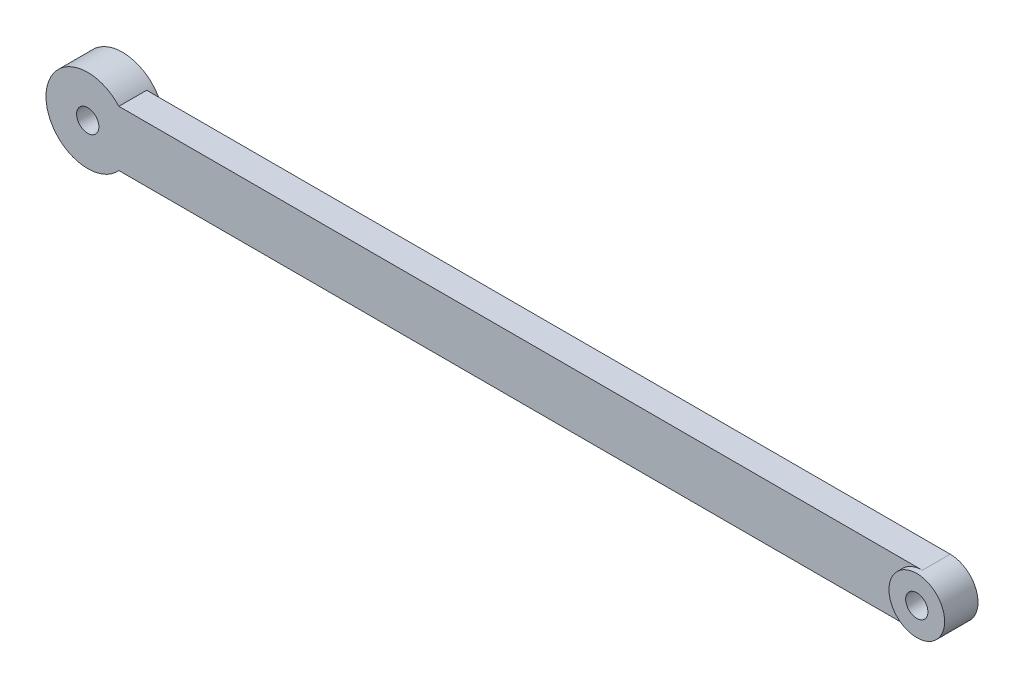
ISO-10303-21;
HEADER;
FILE_DESCRIPTION(('STEP AP214'),'2;1');
FILE_NAME('part.step','',(''),(''),'','','');
FILE_SCHEMA(('AUTOMOTIVE_DESIGN { 1 0 10303 214 1 1 1 1 }'));
ENDSEC;
DATA;
#1=APPLICATION_CONTEXT('core data for automotive mechanical design processes');
#2=APPLICATION_PROTOCOL_DEFINITION('international standard','automotive_design',2000,#1);
#3=PRODUCT_CONTEXT('',#1,'mechanical');
#4=PRODUCT('Part','Part','',(#3));
#5=PRODUCT_RELATED_PRODUCT_CATEGORY('part','',(#4));
#6=PRODUCT_DEFINITION_FORMATION('','',#4);
#7=PRODUCT_DEFINITION_CONTEXT('part definition',#1,'design');
#8=PRODUCT_DEFINITION('design','',#6,#7);
#9=PRODUCT_DEFINITION_SHAPE('','',#8);
#10=(LENGTH_UNIT() NAMED_UNIT(*) SI_UNIT(.MILLI.,.METRE.));
#11=(NAMED_UNIT(*) PLANE_ANGLE_UNIT() SI_UNIT($,.RADIAN.));
#12=(NAMED_UNIT(*) SI_UNIT($,.STERADIAN.) SOLID_ANGLE_UNIT());
#13=UNCERTAINTY_MEASURE_WITH_UNIT(LENGTH_MEASURE(1.E-05),#10,'distance_accuracy_value','');
#14=(GEOMETRIC_REPRESENTATION_CONTEXT(3) GLOBAL_UNCERTAINTY_ASSIGNED_CONTEXT((#13)) GLOBAL_UNIT_ASSIGNED_CONTEXT((#10,
#11,#12)) REPRESENTATION_CONTEXT('',''));
#15=CARTESIAN_POINT('',(0.,0.,0.));
#16=DIRECTION('',(0.,0.,1.));
#17=DIRECTION('',(1.,0.,0.));
#18=AXIS2_PLACEMENT_3D('',#15,#16,#17);
#19=CARTESIAN_POINT('',(56.4784965299947,0.,1.9576839113739));
#20=DIRECTION('',(0.,0.,1.));
#21=DIRECTION('',(1.,0.,0.));
#22=AXIS2_PLACEMENT_3D('',#19,#20,#21);
#23=PLANE('',#22);
#24=CARTESIAN_POINT('',(236.478496529995,0.,1.9576839113739));
#25=DIRECTION('',(0.,0.,-1.));
#26=DIRECTION('',(-1.,0.,0.));
#27=AXIS2_PLACEMENT_3D('',#24,#25,#26);
#28=CIRCLE('',#27,2.4);
#29=CARTESIAN_POINT('',(234.078496529995,0.,1.9576839113739));
#30=VERTEX_POINT('',#29);
#31=EDGE_CURVE('E119',#30,#30,#28,.T.);
#32=ORIENTED_EDGE('',*,*,#31,.F.);
#33=EDGE_LOOP('',(#32));
#34=FACE_BOUND('',#33,.T.);
#35=CARTESIAN_POINT('',(56.4784965299947,0.,1.9576839113739));
#36=DIRECTION('',(0.,0.,-1.));
#37=DIRECTION('',(-1.,0.,0.));
#38=AXIS2_PLACEMENT_3D('',#35,#36,#37);
#39=CIRCLE('',#38,9.);
#40=CARTESIAN_POINT('',(63.1867004624941,6.,1.9576839113739));
#41=VERTEX_POINT('',#40);
#42=CARTESIAN_POINT('',(63.186700462494,-6.00000000000003,1.9576839113739));
#43=VERTEX_POINT('',#42);
#44=EDGE_CURVE('E111',#41,#43,#39,.T.);
#45=ORIENTED_EDGE('',*,*,#44,.F.);
#46=DIRECTION('',(1.,0.,0.));
#47=VECTOR('',#46,1.);
#48=CARTESIAN_POINT('',(56.4784965299947,6.,1.9576839113739));
#49=LINE('',#48,#47);
#50=CARTESIAN_POINT('',(236.478496529995,6.,1.9576839113739));
#51=VERTEX_POINT('',#50);
#52=EDGE_CURVE('E123',#41,#51,#49,.T.);
#53=ORIENTED_EDGE('',*,*,#52,.T.);
#54=CARTESIAN_POINT('',(236.478496529995,0.,1.9576839113739));
#55=DIRECTION('',(0.,0.,1.));
#56=DIRECTION('',(1.,0.,0.));
#57=AXIS2_PLACEMENT_3D('',#54,#55,#56);
#58=CIRCLE('',#57,6.00000000000002);
#59=CARTESIAN_POINT('',(236.478496529995,-6.,1.9576839113739));
#60=VERTEX_POINT('',#59);
#61=EDGE_CURVE('E11',#60,#51,#58,.T.);
#62=ORIENTED_EDGE('',*,*,#61,.F.);
#63=DIRECTION('',(-1.,0.,0.));
#64=VECTOR('',#63,1.);
#65=CARTESIAN_POINT('',(56.4784965299947,-6.00000000000003,1.9576839113739));
#66=LINE('',#65,#64);
#67=EDGE_CURVE('E94',#60,#43,#66,.T.);
#68=ORIENTED_EDGE('',*,*,#67,.T.);
#69=EDGE_LOOP('',(#45,#53,#62,#68));
#70=FACE_BOUND('',#69,.T.);
#71=ADVANCED_FACE('F43',(#34,#70),#23,.F.);
#72=CARTESIAN_POINT('',(236.478496529995,0.,7.95768391137391));
#73=DIRECTION('',(0.,0.,-1.));
#74=DIRECTION('',(-1.,0.,0.));
#75=AXIS2_PLACEMENT_3D('',#72,#73,#74);
#76=CYLINDRICAL_SURFACE('',#75,6.00000000000002);
#77=DIRECTION('',(0.,0.,-1.));
#78=VECTOR('',#77,1.);
#79=CARTESIAN_POINT('',(236.478496529995,6.,7.95768391137391));
#80=LINE('',#79,#78);
#81=CARTESIAN_POINT('',(236.478496529995,6.00000000000002,7.95768391137391));
#82=VERTEX_POINT('',#81);
#83=EDGE_CURVE('E51',#82,#51,#80,.T.);
#84=ORIENTED_EDGE('',*,*,#83,.F.);
#85=CARTESIAN_POINT('',(236.478496529995,0.,7.95768391137391));
#86=DIRECTION('',(0.,0.,1.));
#87=DIRECTION('',(1.,0.,0.));
#88=AXIS2_PLACEMENT_3D('',#85,#86,#87);
#89=CIRCLE('',#88,6.00000000000002);
#90=CARTESIAN_POINT('',(236.478496529995,-6.,7.95768391137391));
#91=VERTEX_POINT('',#90);
#92=EDGE_CURVE('E98',#82,#91,#89,.T.);
#93=ORIENTED_EDGE('',*,*,#92,.T.);
#94=DIRECTION('',(0.,0.,-1.));
#95=VECTOR('',#94,1.);
#96=CARTESIAN_POINT('',(236.478496529995,-6.,7.95768391137391));
#97=LINE('',#96,#95);
#98=EDGE_CURVE('E58',#91,#60,#97,.T.);
#99=ORIENTED_EDGE('',*,*,#98,.T.);
#100=ORIENTED_EDGE('',*,*,#61,.T.);
#101=EDGE_LOOP('',(#84,#93,#99,#100));
#102=FACE_BOUND('',#101,.T.);
#103=CARTESIAN_POINT('',(236.478496529995,0.,9.1576839113739));
#104=DIRECTION('',(0.,0.,1.));
#105=DIRECTION('',(1.,0.,0.));
#106=AXIS2_PLACEMENT_3D('',#103,#104,#105);
#107=CIRCLE('',#106,6.00000000000002);
#108=CARTESIAN_POINT('',(242.478496529995,0.,9.1576839113739));
#109=VERTEX_POINT('',#108);
#110=EDGE_CURVE('E104',#109,#109,#107,.T.);
#111=ORIENTED_EDGE('',*,*,#110,.F.);
#112=EDGE_LOOP('',(#111));
#113=FACE_BOUND('',#112,.T.);
#114=ADVANCED_FACE('F45',(#102,#113),#76,.T.);
#115=CARTESIAN_POINT('',(56.4784965299947,0.,7.95768391137391));
#116=DIRECTION('',(0.,0.,1.));
#117=DIRECTION('',(1.,0.,0.));
#118=AXIS2_PLACEMENT_3D('',#115,#116,#117);
#119=PLANE('',#118);
#120=ORIENTED_EDGE('',*,*,#92,.F.);
#121=DIRECTION('',(1.,0.,0.));
#122=VECTOR('',#121,1.);
#123=CARTESIAN_POINT('',(56.4784965299947,6.,7.95768391137391));
#124=LINE('',#123,#122);
#125=CARTESIAN_POINT('',(63.1867004624941,6.,7.95768391137391));
#126=VERTEX_POINT('',#125);
#127=EDGE_CURVE('E84',#126,#82,#124,.T.);
#128=ORIENTED_EDGE('',*,*,#127,.F.);
#129=CARTESIAN_POINT('',(56.4784965299947,0.,7.95768391137391));
#130=DIRECTION('',(0.,0.,1.));
#131=DIRECTION('',(1.,0.,0.));
#132=AXIS2_PLACEMENT_3D('',#129,#130,#131);
#133=CIRCLE('',#132,9.);
#134=CARTESIAN_POINT('',(63.186700462494,-6.00000000000003,7.95768391137391));
#135=VERTEX_POINT('',#134);
#136=EDGE_CURVE('E122',#126,#135,#133,.T.);
#137=ORIENTED_EDGE('',*,*,#136,.T.);
#138=DIRECTION('',(-1.,0.,0.));
#139=VECTOR('',#138,1.);
#140=CARTESIAN_POINT('',(56.4784965299947,-6.00000000000003,7.95768391137391));
#141=LINE('',#140,#139);
#142=EDGE_CURVE('E93',#91,#135,#141,.T.);
#143=ORIENTED_EDGE('',*,*,#142,.F.);
#144=EDGE_LOOP('',(#120,#128,#137,#143));
#145=FACE_BOUND('',#144,.T.);
#146=CARTESIAN_POINT('',(56.4784965299947,0.,7.95768391137391));
#147=DIRECTION('',(0.,0.,1.));
#148=DIRECTION('',(1.,0.,0.));
#149=AXIS2_PLACEMENT_3D('',#146,#147,#148);
#150=CIRCLE('',#149,2.4);
#151=CARTESIAN_POINT('',(58.8784965299947,0.,7.95768391137391));
#152=VERTEX_POINT('',#151);
#153=EDGE_CURVE('E115',#152,#152,#150,.T.);
#154=ORIENTED_EDGE('',*,*,#153,.F.);
#155=EDGE_LOOP('',(#154));
#156=FACE_BOUND('',#155,.T.);
#157=ADVANCED_FACE('F99',(#145,#156),#119,.T.);
#158=CARTESIAN_POINT('',(56.4784965299947,6.,7.95768391137391));
#159=DIRECTION('',(0.,1.,0.));
#160=DIRECTION('',(0.,0.,1.));
#161=AXIS2_PLACEMENT_3D('',#158,#159,#160);
#162=PLANE('',#161);
#163=ORIENTED_EDGE('',*,*,#52,.F.);
#164=DIRECTION('',(0.,0.,-1.));
#165=VECTOR('',#164,1.);
#166=CARTESIAN_POINT('',(63.1867004624941,6.,7.95768391137391));
#167=LINE('',#166,#165);
#168=EDGE_CURVE('E89',#126,#41,#167,.T.);
#169=ORIENTED_EDGE('',*,*,#168,.F.);
#170=ORIENTED_EDGE('',*,*,#127,.T.);
#171=ORIENTED_EDGE('',*,*,#83,.T.);
#172=EDGE_LOOP('',(#163,#169,#170,#171));
#173=FACE_BOUND('',#172,.T.);
#174=ADVANCED_FACE('F86',(#173),#162,.T.);
#175=CARTESIAN_POINT('',(56.4784965299947,-6.00000000000003,7.95768391137391));
#176=DIRECTION('',(0.,-1.,0.));
#177=DIRECTION('',(1.,0.,0.));
#178=AXIS2_PLACEMENT_3D('',#175,#176,#177);
#179=PLANE('',#178);
#180=ORIENTED_EDGE('',*,*,#67,.F.);
#181=ORIENTED_EDGE('',*,*,#98,.F.);
#182=ORIENTED_EDGE('',*,*,#142,.T.);
#183=DIRECTION('',(0.,0.,-1.));
#184=VECTOR('',#183,1.);
#185=CARTESIAN_POINT('',(63.186700462494,-6.00000000000003,7.95768391137391));
#186=LINE('',#185,#184);
#187=EDGE_CURVE('E130',#135,#43,#186,.T.);
#188=ORIENTED_EDGE('',*,*,#187,.T.);
#189=EDGE_LOOP('',(#180,#181,#182,#188));
#190=FACE_BOUND('',#189,.T.);
#191=ADVANCED_FACE('F137',(#190),#179,.T.);
#192=CARTESIAN_POINT('',(56.4784965299947,0.,7.95768391137391));
#193=DIRECTION('',(0.,0.,-1.));
#194=DIRECTION('',(-1.,0.,0.));
#195=AXIS2_PLACEMENT_3D('',#192,#193,#194);
#196=CYLINDRICAL_SURFACE('',#195,9.);
#197=ORIENTED_EDGE('',*,*,#168,.T.);
#198=ORIENTED_EDGE('',*,*,#44,.T.);
#199=ORIENTED_EDGE('',*,*,#187,.F.);
#200=ORIENTED_EDGE('',*,*,#136,.F.);
#201=EDGE_LOOP('',(#197,#198,#199,#200));
#202=FACE_BOUND('',#201,.T.);
#203=CARTESIAN_POINT('',(56.4784965299947,0.,0.457683911373905));
#204=DIRECTION('',(0.,0.,-1.));
#205=DIRECTION('',(-1.,0.,0.));
#206=AXIS2_PLACEMENT_3D('',#203,#204,#205);
#207=CIRCLE('',#206,9.);
#208=CARTESIAN_POINT('',(47.4784965299947,0.,0.457683911373905));
#209=VERTEX_POINT('',#208);
#210=EDGE_CURVE('E112',#209,#209,#207,.T.);
#211=ORIENTED_EDGE('',*,*,#210,.F.);
#212=EDGE_LOOP('',(#211));
#213=FACE_BOUND('',#212,.T.);
#214=ADVANCED_FACE('F134',(#202,#213),#196,.T.);
#215=CARTESIAN_POINT('',(236.478496529995,0.,13.9576839113739));
#216=DIRECTION('',(0.,0.,-1.));
#217=DIRECTION('',(-1.,0.,0.));
#218=AXIS2_PLACEMENT_3D('',#215,#216,#217);
#219=CYLINDRICAL_SURFACE('',#218,2.4);
#220=ORIENTED_EDGE('',*,*,#31,.T.);
#221=EDGE_LOOP('',(#220));
#222=FACE_BOUND('',#221,.T.);
#223=CARTESIAN_POINT('',(236.478496529995,0.,9.1576839113739));
#224=DIRECTION('',(0.,0.,1.));
#225=DIRECTION('',(1.,0.,0.));
#226=AXIS2_PLACEMENT_3D('',#223,#224,#225);
#227=CIRCLE('',#226,2.4);
#228=CARTESIAN_POINT('',(238.878496529995,0.,9.1576839113739));
#229=VERTEX_POINT('',#228);
#230=EDGE_CURVE('E101',#229,#229,#227,.F.);
#231=ORIENTED_EDGE('',*,*,#230,.F.);
#232=EDGE_LOOP('',(#231));
#233=FACE_BOUND('',#232,.T.);
#234=ADVANCED_FACE('F144',(#222,#233),#219,.F.);
#235=CARTESIAN_POINT('',(56.4784965299947,0.,13.9576839113739));
#236=DIRECTION('',(0.,0.,-1.));
#237=DIRECTION('',(-1.,0.,0.));
#238=AXIS2_PLACEMENT_3D('',#235,#236,#237);
#239=CYLINDRICAL_SURFACE('',#238,2.4);
#240=ORIENTED_EDGE('',*,*,#153,.T.);
#241=EDGE_LOOP('',(#240));
#242=FACE_BOUND('',#241,.T.);
#243=CARTESIAN_POINT('',(56.4784965299947,0.,0.457683911373905));
#244=DIRECTION('',(0.,0.,-1.));
#245=DIRECTION('',(-1.,0.,0.));
#246=AXIS2_PLACEMENT_3D('',#243,#244,#245);
#247=CIRCLE('',#246,2.4);
#248=CARTESIAN_POINT('',(54.0784965299947,0.,0.457683911373905));
#249=VERTEX_POINT('',#248);
#250=EDGE_CURVE('E108',#249,#249,#247,.T.);
#251=ORIENTED_EDGE('',*,*,#250,.T.);
#252=EDGE_LOOP('',(#251));
#253=FACE_BOUND('',#252,.T.);
#254=ADVANCED_FACE('F186',(#242,#253),#239,.F.);
#255=CARTESIAN_POINT('',(56.4784965299947,0.,0.457683911373905));
#256=DIRECTION('',(0.,0.,-1.));
#257=DIRECTION('',(-1.,0.,0.));
#258=AXIS2_PLACEMENT_3D('',#255,#256,#257);
#259=PLANE('',#258);
#260=ORIENTED_EDGE('',*,*,#210,.T.);
#261=EDGE_LOOP('',(#260));
#262=FACE_BOUND('',#261,.T.);
#263=ORIENTED_EDGE('',*,*,#250,.F.);
#264=EDGE_LOOP('',(#263));
#265=FACE_BOUND('',#264,.T.);
#266=ADVANCED_FACE('F197',(#262,#265),#259,.T.);
#267=CARTESIAN_POINT('',(56.4784965299947,0.,9.1576839113739));
#268=DIRECTION('',(0.,0.,1.));
#269=DIRECTION('',(1.,0.,0.));
#270=AXIS2_PLACEMENT_3D('',#267,#268,#269);
#271=PLANE('',#270);
#272=ORIENTED_EDGE('',*,*,#230,.T.);
#273=EDGE_LOOP('',(#272));
#274=FACE_BOUND('',#273,.T.);
#275=ORIENTED_EDGE('',*,*,#110,.T.);
#276=EDGE_LOOP('',(#275));
#277=FACE_BOUND('',#276,.T.);
#278=ADVANCED_FACE('F208',(#274,#277),#271,.T.);
#279=CLOSED_SHELL('',(#71,#114,#157,#174,#191,#214,#234,#254,#266,#278));
#280=MANIFOLD_SOLID_BREP('B2',#279);
#281=ADVANCED_BREP_SHAPE_REPRESENTATION('',(#18,#280),#14);
#282=SHAPE_DEFINITION_REPRESENTATION(#9,#281);
ENDSEC;
END-ISO-10303-21;
